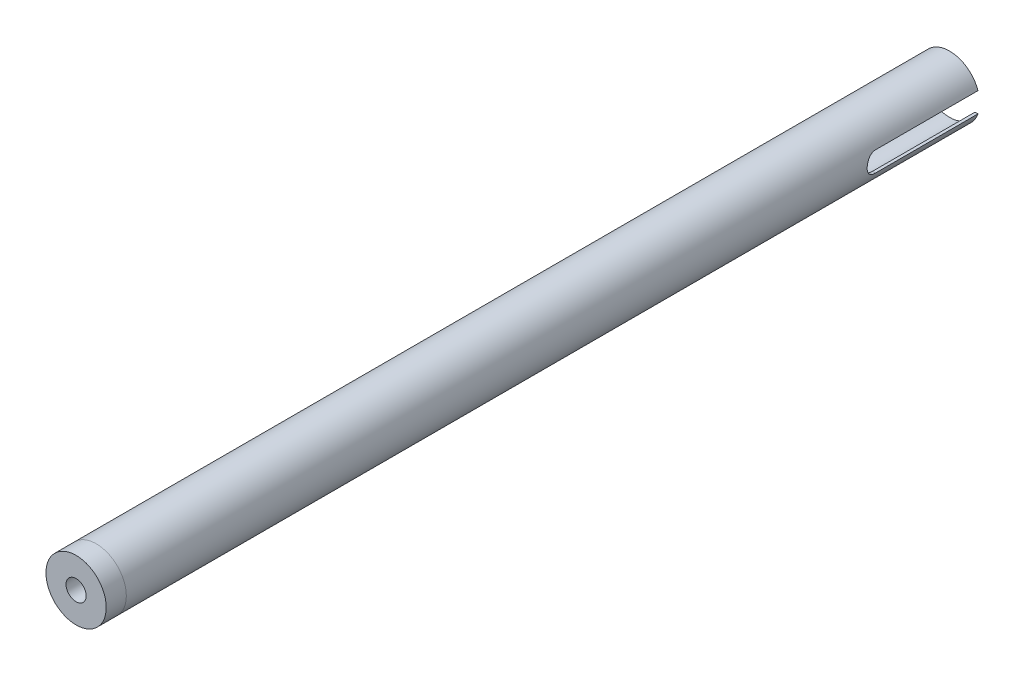
ISO-10303-21;
HEADER;
FILE_DESCRIPTION(('STEP AP214'),'2;1');
FILE_NAME('part.step','',(''),(''),'','','');
FILE_SCHEMA(('AUTOMOTIVE_DESIGN { 1 0 10303 214 1 1 1 1 }'));
ENDSEC;
DATA;
#1=APPLICATION_CONTEXT('core data for automotive mechanical design processes');
#2=APPLICATION_PROTOCOL_DEFINITION('international standard','automotive_design',2000,#1);
#3=PRODUCT_CONTEXT('',#1,'mechanical');
#4=PRODUCT('Part','Part','',(#3));
#5=PRODUCT_RELATED_PRODUCT_CATEGORY('part','',(#4));
#6=PRODUCT_DEFINITION_FORMATION('','',#4);
#7=PRODUCT_DEFINITION_CONTEXT('part definition',#1,'design');
#8=PRODUCT_DEFINITION('design','',#6,#7);
#9=PRODUCT_DEFINITION_SHAPE('','',#8);
#10=(LENGTH_UNIT() NAMED_UNIT(*) SI_UNIT(.MILLI.,.METRE.));
#11=(NAMED_UNIT(*) PLANE_ANGLE_UNIT() SI_UNIT($,.RADIAN.));
#12=(NAMED_UNIT(*) SI_UNIT($,.STERADIAN.) SOLID_ANGLE_UNIT());
#13=UNCERTAINTY_MEASURE_WITH_UNIT(LENGTH_MEASURE(1.E-05),#10,'distance_accuracy_value','');
#14=(GEOMETRIC_REPRESENTATION_CONTEXT(3) GLOBAL_UNCERTAINTY_ASSIGNED_CONTEXT((#13)) GLOBAL_UNIT_ASSIGNED_CONTEXT((#10,
#11,#12)) REPRESENTATION_CONTEXT('',''));
#15=CARTESIAN_POINT('',(0.,0.,0.));
#16=DIRECTION('',(0.,0.,1.));
#17=DIRECTION('',(1.,0.,0.));
#18=AXIS2_PLACEMENT_3D('',#15,#16,#17);
#19=CARTESIAN_POINT('',(0.,0.,-275.981356586574));
#20=DIRECTION('',(0.,0.,1.));
#21=DIRECTION('',(1.,0.,0.));
#22=AXIS2_PLACEMENT_3D('',#19,#20,#21);
#23=CYLINDRICAL_SURFACE('',#22,9.525);
#24=CARTESIAN_POINT('',(0.,0.,-6.35));
#25=DIRECTION('',(0.,0.,1.));
#26=DIRECTION('',(1.,0.,0.));
#27=AXIS2_PLACEMENT_3D('',#24,#25,#26);
#28=CIRCLE('',#27,9.525);
#29=CARTESIAN_POINT('',(9.525,0.,-6.35));
#30=VERTEX_POINT('',#29);
#31=EDGE_CURVE('E165',#30,#30,#28,.T.);
#32=ORIENTED_EDGE('',*,*,#31,.F.);
#33=EDGE_LOOP('',(#32));
#34=FACE_BOUND('',#33,.T.);
#35=CARTESIAN_POINT('',(-8.98025612106915,3.175,-243.596356586574));
#36=CARTESIAN_POINT('',(-8.98024230233901,3.17501142134308,-243.509730483238));
#37=CARTESIAN_POINT('',(-8.98150922759707,3.17145501317748,-243.423112100762));
#38=CARTESIAN_POINT('',(-8.98650170400112,3.1572955094353,-243.250547285936));
#39=CARTESIAN_POINT('',(-8.99022659113085,3.14669431699564,-243.164600678451));
#40=CARTESIAN_POINT('',(-9.00001740508998,3.11857670914846,-242.994246437286));
#41=CARTESIAN_POINT('',(-9.00607621805002,3.10108130380329,-242.909834935478));
#42=CARTESIAN_POINT('',(-9.02033586435303,3.05935434973545,-242.742900134143));
#43=CARTESIAN_POINT('',(-9.02853677497232,3.03512255799513,-242.660376902851));
#44=CARTESIAN_POINT('',(-9.05598792154067,2.95264369348964,-242.416578279575));
#45=CARTESIAN_POINT('',(-9.07810200713862,2.88457148458964,-242.258824695251));
#46=CARTESIAN_POINT('',(-9.127451360236,2.72437908867647,-241.956948176762));
#47=CARTESIAN_POINT('',(-9.15468995097455,2.63224328129309,-241.812834179533));
#48=CARTESIAN_POINT('',(-9.21240416673121,2.42269155952414,-241.536681319709));
#49=CARTESIAN_POINT('',(-9.24296008478943,2.30449853156512,-241.405247737847));
#50=CARTESIAN_POINT('',(-9.30318902123143,2.04784031127145,-241.16365244151));
#51=CARTESIAN_POINT('',(-9.33286185998227,1.90937102786996,-241.053495030278));
#52=CARTESIAN_POINT('',(-9.38892492365178,1.61159672697579,-240.85477801879));
#53=CARTESIAN_POINT('',(-9.41520772598947,1.45183792838569,-240.76686583278));
#54=CARTESIAN_POINT('',(-9.46054712430069,1.11883883316161,-240.61946110671));
#55=CARTESIAN_POINT('',(-9.47961052807859,0.945611424033749,-240.559941778708));
#56=CARTESIAN_POINT('',(-9.50410661247238,0.642992499572345,-240.484463014213));
#57=CARTESIAN_POINT('',(-9.51189798251809,0.515662964135989,-240.460845042169));
#58=CARTESIAN_POINT('',(-9.51973491912187,0.323120458247677,-240.437178775996));
#59=CARTESIAN_POINT('',(-9.52170555244691,0.258670486244967,-240.431250128379));
#60=CARTESIAN_POINT('',(-9.52433958502699,0.129484930346638,-240.423337503713));
#61=CARTESIAN_POINT('',(-9.5250026318504,0.0647492741617516,-240.421354590148));
#62=CARTESIAN_POINT('',(-9.525,0.,-240.421356586574));
#63=B_SPLINE_CURVE_WITH_KNOTS('',3,(#35,#36,#37,#38,#39,#40,#41,#42,#43,#44,#45,#46,#47,#48,#49,
#50,#51,#52,#53,#54,#55,#56,#57,#58,#59,#60,#61,#62),.UNSPECIFIED.,.F.,.F.,(4,2,2,2,2,2,2,2,2,2,
2,2,2,4),(0.,0.259783027985073,0.519495904525415,0.778423354079382,1.0373601457496,
1.55448370709136,2.07194378605916,2.60765740005747,3.14347925237351,3.69345572792677,
4.24291228331232,4.63105001394517,4.8251849841295,5.01937227204627),.UNSPECIFIED.);
#64=CARTESIAN_POINT('',(-8.98025612106915,3.175,-243.596356586574));
#65=VERTEX_POINT('',#64);
#66=CARTESIAN_POINT('',(-9.525,0.,-240.421356586574));
#67=VERTEX_POINT('',#66);
#68=EDGE_CURVE('E192',#65,#67,#63,.T.);
#69=ORIENTED_EDGE('',*,*,#68,.T.);
#70=CARTESIAN_POINT('',(-9.525,0.,-240.421356586574));
#71=CARTESIAN_POINT('',(-9.52501110102584,-0.0867614879611002,-240.421345481537));
#72=CARTESIAN_POINT('',(-9.52381482114642,-0.173516026970682,-240.424912693194));
#73=CARTESIAN_POINT('',(-9.51909010104991,-0.346361025979099,-240.439117531776));
#74=CARTESIAN_POINT('',(-9.51556219632442,-0.432451633867615,-240.449753535253));
#75=CARTESIAN_POINT('',(-9.50626969526085,-0.603121388983422,-240.477970526766));
#76=CARTESIAN_POINT('',(-9.50051134567603,-0.687704073408633,-240.495532120935));
#77=CARTESIAN_POINT('',(-9.48692170416637,-0.854983898510568,-240.537423441573));
#78=CARTESIAN_POINT('',(-9.47909035815865,-0.937680989932476,-240.561753344623));
#79=CARTESIAN_POINT('',(-9.45278540829331,-1.18202731628103,-240.644587737561));
#80=CARTESIAN_POINT('',(-9.43148823554423,-1.34014986693319,-240.712973418907));
#81=CARTESIAN_POINT('',(-9.38354405256208,-1.64264414222567,-240.873899944683));
#82=CARTESIAN_POINT('',(-9.35689419571071,-1.78700848960572,-240.966453649836));
#83=CARTESIAN_POINT('',(-9.30002401422067,-2.06291632995429,-241.176447078041));
#84=CARTESIAN_POINT('',(-9.26971861159363,-2.19392359690275,-241.294569363461));
#85=CARTESIAN_POINT('',(-9.20941732427212,-2.43468689521898,-241.550907340296));
#86=CARTESIAN_POINT('',(-9.1794215361322,-2.54443647619592,-241.689129108454));
#87=CARTESIAN_POINT('',(-9.122187697517,-2.74268087840455,-241.986637087501));
#88=CARTESIAN_POINT('',(-9.09505529775998,-2.83046425019683,-242.146419225575));
#89=CARTESIAN_POINT('',(-9.04794936227173,-2.97762337182932,-242.47946354758));
#90=CARTESIAN_POINT('',(-9.0279682579705,-3.03702917747986,-242.652711242388));
#91=CARTESIAN_POINT('',(-9.00226999890487,-3.11221256504251,-242.954998276382));
#92=CARTESIAN_POINT('',(-8.99408207355733,-3.13569679171672,-243.08196059781));
#93=CARTESIAN_POINT('',(-8.98304472933549,-3.16711304593222,-243.338037769579));
#94=CARTESIAN_POINT('',(-8.98019613476149,-3.17504267212105,-243.467152949181));
#95=CARTESIAN_POINT('',(-8.98025612106915,-3.175,-243.596356586574));
#96=B_SPLINE_CURVE_WITH_KNOTS('',3,(#70,#71,#72,#73,#74,#75,#76,#77,#78,#79,#80,#81,#82,#83,#84,
#85,#86,#87,#88,#89,#90,#91,#92,#93,#94,#95),.UNSPECIFIED.,.F.,.F.,(4,2,2,2,2,2,2,2,2,2,2,2,4),
(0.,0.260191091827301,0.520322447737218,0.779730467212509,1.03914525511039,1.55731822615721,
2.07576750062864,2.61028978360819,3.14497400776477,3.69521752133767,4.24487695078963,
4.63199348452993,5.01916977744545),.UNSPECIFIED.);
#97=CARTESIAN_POINT('',(-8.98025612106916,-3.175,-243.596356586574));
#98=VERTEX_POINT('',#97);
#99=EDGE_CURVE('E144',#67,#98,#96,.T.);
#100=ORIENTED_EDGE('',*,*,#99,.T.);
#101=DIRECTION('',(0.,0.,-1.));
#102=VECTOR('',#101,1.);
#103=CARTESIAN_POINT('',(-8.98025612106916,-3.175,-240.421356586574));
#104=LINE('',#103,#102);
#105=CARTESIAN_POINT('',(-8.98025612106916,-3.175,-275.981356586574));
#106=VERTEX_POINT('',#105);
#107=EDGE_CURVE('E139',#98,#106,#104,.T.);
#108=ORIENTED_EDGE('',*,*,#107,.T.);
#109=CARTESIAN_POINT('',(0.,0.,-275.981356586574));
#110=DIRECTION('',(0.,0.,1.));
#111=DIRECTION('',(1.,0.,0.));
#112=AXIS2_PLACEMENT_3D('',#109,#110,#111);
#113=CIRCLE('',#112,9.525);
#114=CARTESIAN_POINT('',(8.98025612106915,-3.175,-275.981356586574));
#115=VERTEX_POINT('',#114);
#116=EDGE_CURVE('E142',#106,#115,#113,.T.);
#117=ORIENTED_EDGE('',*,*,#116,.T.);
#118=DIRECTION('',(0.,0.,-1.));
#119=VECTOR('',#118,1.);
#120=CARTESIAN_POINT('',(8.98025612106915,-3.175,-240.421356586574));
#121=LINE('',#120,#119);
#122=CARTESIAN_POINT('',(8.98025612106915,-3.175,-243.596356586574));
#123=VERTEX_POINT('',#122);
#124=EDGE_CURVE('E425',#123,#115,#121,.T.);
#125=ORIENTED_EDGE('',*,*,#124,.F.);
#126=CARTESIAN_POINT('',(8.98025612106915,-3.175,-243.596356586574));
#127=CARTESIAN_POINT('',(8.98024230233901,-3.17501142134308,-243.509730483238));
#128=CARTESIAN_POINT('',(8.98150922759707,-3.17145501317748,-243.423112100762));
#129=CARTESIAN_POINT('',(8.98650170400112,-3.1572955094353,-243.250547285936));
#130=CARTESIAN_POINT('',(8.99022659113085,-3.14669431699564,-243.164600678451));
#131=CARTESIAN_POINT('',(9.00001740508998,-3.11857670914846,-242.994246437286));
#132=CARTESIAN_POINT('',(9.00607621805002,-3.10108130380329,-242.909834935478));
#133=CARTESIAN_POINT('',(9.02033586435303,-3.05935434973545,-242.742900134143));
#134=CARTESIAN_POINT('',(9.02853677497232,-3.03512255799513,-242.660376902851));
#135=CARTESIAN_POINT('',(9.05598792154067,-2.95264369348964,-242.416578279575));
#136=CARTESIAN_POINT('',(9.07810200713862,-2.88457148458964,-242.258824695251));
#137=CARTESIAN_POINT('',(9.127451360236,-2.72437908867647,-241.956948176762));
#138=CARTESIAN_POINT('',(9.15468995097455,-2.63224328129309,-241.812834179533));
#139=CARTESIAN_POINT('',(9.21240416673121,-2.42269155952414,-241.536681319709));
#140=CARTESIAN_POINT('',(9.24296008478943,-2.30449853156512,-241.405247737847));
#141=CARTESIAN_POINT('',(9.30318902123143,-2.04784031127145,-241.16365244151));
#142=CARTESIAN_POINT('',(9.33286185998227,-1.90937102786996,-241.053495030278));
#143=CARTESIAN_POINT('',(9.38892492365178,-1.61159672697579,-240.85477801879));
#144=CARTESIAN_POINT('',(9.41520772598947,-1.45183792838569,-240.76686583278));
#145=CARTESIAN_POINT('',(9.46054712430069,-1.11883883316161,-240.61946110671));
#146=CARTESIAN_POINT('',(9.47961052807859,-0.945611424033749,-240.559941778708));
#147=CARTESIAN_POINT('',(9.50410661247238,-0.642992499572345,-240.484463014213));
#148=CARTESIAN_POINT('',(9.51189798251809,-0.515662964135989,-240.460845042169));
#149=CARTESIAN_POINT('',(9.51973491912187,-0.323120458247677,-240.437178775996));
#150=CARTESIAN_POINT('',(9.52170555244691,-0.258670486244967,-240.431250128379));
#151=CARTESIAN_POINT('',(9.52433958502699,-0.129484930346638,-240.423337503713));
#152=CARTESIAN_POINT('',(9.5250026318504,-0.0647492741617516,-240.421354590148));
#153=CARTESIAN_POINT('',(9.525,0.,-240.421356586574));
#154=B_SPLINE_CURVE_WITH_KNOTS('',3,(#126,#127,#128,#129,#130,#131,#132,#133,#134,#135,#136,
#137,#138,#139,#140,#141,#142,#143,#144,#145,#146,#147,#148,#149,#150,#151,#152,#153),
.UNSPECIFIED.,.F.,.F.,(4,2,2,2,2,2,2,2,2,2,2,2,2,4),(0.,0.259783027985073,0.519495904525415,
0.778423354079382,1.0373601457496,1.55448370709136,2.07194378605916,2.60765740005747,
3.14347925237351,3.69345572792677,4.24291228331232,4.63105001394517,4.8251849841295,
5.01937227204627),.UNSPECIFIED.);
#155=CARTESIAN_POINT('',(9.525,0.,-240.421356586574));
#156=VERTEX_POINT('',#155);
#157=EDGE_CURVE('E85',#123,#156,#154,.T.);
#158=ORIENTED_EDGE('',*,*,#157,.T.);
#159=CARTESIAN_POINT('',(9.525,0.,-240.421356586574));
#160=CARTESIAN_POINT('',(9.52501110102584,0.0867614879611002,-240.421345481537));
#161=CARTESIAN_POINT('',(9.52381482114642,0.173516026970682,-240.424912693194));
#162=CARTESIAN_POINT('',(9.51909010104991,0.346361025979099,-240.439117531776));
#163=CARTESIAN_POINT('',(9.51556219632442,0.432451633867615,-240.449753535253));
#164=CARTESIAN_POINT('',(9.50626969526085,0.603121388983422,-240.477970526766));
#165=CARTESIAN_POINT('',(9.50051134567603,0.687704073408633,-240.495532120935));
#166=CARTESIAN_POINT('',(9.48692170416637,0.854983898510568,-240.537423441573));
#167=CARTESIAN_POINT('',(9.47909035815865,0.937680989932476,-240.561753344623));
#168=CARTESIAN_POINT('',(9.45278540829331,1.18202731628103,-240.644587737561));
#169=CARTESIAN_POINT('',(9.43148823554423,1.34014986693319,-240.712973418907));
#170=CARTESIAN_POINT('',(9.38354405256208,1.64264414222567,-240.873899944683));
#171=CARTESIAN_POINT('',(9.35689419571071,1.78700848960572,-240.966453649836));
#172=CARTESIAN_POINT('',(9.30002401422067,2.06291632995429,-241.176447078041));
#173=CARTESIAN_POINT('',(9.26971861159363,2.19392359690275,-241.294569363461));
#174=CARTESIAN_POINT('',(9.20941732427212,2.43468689521898,-241.550907340296));
#175=CARTESIAN_POINT('',(9.1794215361322,2.54443647619592,-241.689129108454));
#176=CARTESIAN_POINT('',(9.122187697517,2.74268087840455,-241.986637087501));
#177=CARTESIAN_POINT('',(9.09505529775998,2.83046425019683,-242.146419225575));
#178=CARTESIAN_POINT('',(9.04794936227173,2.97762337182932,-242.47946354758));
#179=CARTESIAN_POINT('',(9.0279682579705,3.03702917747986,-242.652711242388));
#180=CARTESIAN_POINT('',(9.00226999890487,3.11221256504251,-242.954998276382));
#181=CARTESIAN_POINT('',(8.99408207355733,3.13569679171672,-243.08196059781));
#182=CARTESIAN_POINT('',(8.98304472933549,3.16711304593222,-243.338037769579));
#183=CARTESIAN_POINT('',(8.98019613476149,3.17504267212105,-243.467152949181));
#184=CARTESIAN_POINT('',(8.98025612106915,3.175,-243.596356586574));
#185=B_SPLINE_CURVE_WITH_KNOTS('',3,(#159,#160,#161,#162,#163,#164,#165,#166,#167,#168,#169,
#170,#171,#172,#173,#174,#175,#176,#177,#178,#179,#180,#181,#182,#183,#184),.UNSPECIFIED.,.F.,
.F.,(4,2,2,2,2,2,2,2,2,2,2,2,4),(0.,0.260191091827301,0.520322447737218,0.779730467212509,
1.03914525511039,1.55731822615721,2.07576750062864,2.61028978360819,3.14497400776477,
3.69521752133767,4.24487695078963,4.63199348452993,5.01916977744545),.UNSPECIFIED.);
#186=CARTESIAN_POINT('',(8.98025612106915,3.175,-243.596356586574));
#187=VERTEX_POINT('',#186);
#188=EDGE_CURVE('E71',#156,#187,#185,.T.);
#189=ORIENTED_EDGE('',*,*,#188,.T.);
#190=DIRECTION('',(0.,0.,-1.));
#191=VECTOR('',#190,1.);
#192=CARTESIAN_POINT('',(8.98025612106915,3.175,-240.421356586574));
#193=LINE('',#192,#191);
#194=CARTESIAN_POINT('',(8.98025612106915,3.175,-275.981356586574));
#195=VERTEX_POINT('',#194);
#196=EDGE_CURVE('E158',#187,#195,#193,.T.);
#197=ORIENTED_EDGE('',*,*,#196,.T.);
#198=CARTESIAN_POINT('',(-8.98025612106915,3.175,-275.981356586574));
#199=VERTEX_POINT('',#198);
#200=EDGE_CURVE('E164',#195,#199,#113,.T.);
#201=ORIENTED_EDGE('',*,*,#200,.T.);
#202=DIRECTION('',(0.,0.,-1.));
#203=VECTOR('',#202,1.);
#204=CARTESIAN_POINT('',(-8.98025612106915,3.175,-240.421356586574));
#205=LINE('',#204,#203);
#206=EDGE_CURVE('E418',#65,#199,#205,.T.);
#207=ORIENTED_EDGE('',*,*,#206,.F.);
#208=EDGE_LOOP('',(#69,#100,#108,#117,#125,#158,#189,#197,#201,#207));
#209=FACE_BOUND('',#208,.T.);
#210=ADVANCED_FACE('F61',(#34,#209),#23,.T.);
#211=CARTESIAN_POINT('',(0.,0.,-275.981356586574));
#212=DIRECTION('',(0.,0.,1.));
#213=DIRECTION('',(1.,0.,0.));
#214=AXIS2_PLACEMENT_3D('',#211,#212,#213);
#215=PLANE('',#214);
#216=DIRECTION('',(1.,0.,0.));
#217=VECTOR('',#216,1.);
#218=CARTESIAN_POINT('',(0.,-3.175,-275.981356586574));
#219=LINE('',#218,#217);
#220=CARTESIAN_POINT('',(-8.03118117091129,-3.175,-275.981356586574));
#221=VERTEX_POINT('',#220);
#222=EDGE_CURVE('E151',#106,#221,#219,.T.);
#223=ORIENTED_EDGE('',*,*,#222,.T.);
#224=CARTESIAN_POINT('',(0.,0.,-275.981356586574));
#225=DIRECTION('',(0.,0.,1.));
#226=DIRECTION('',(1.,0.,0.));
#227=AXIS2_PLACEMENT_3D('',#224,#225,#226);
#228=CIRCLE('',#227,8.636);
#229=CARTESIAN_POINT('',(8.03118117091129,-3.175,-275.981356586574));
#230=VERTEX_POINT('',#229);
#231=EDGE_CURVE('E273',#221,#230,#228,.T.);
#232=ORIENTED_EDGE('',*,*,#231,.T.);
#233=DIRECTION('',(1.,0.,0.));
#234=VECTOR('',#233,1.);
#235=CARTESIAN_POINT('',(0.,-3.175,-275.981356586574));
#236=LINE('',#235,#234);
#237=EDGE_CURVE('E163',#230,#115,#236,.T.);
#238=ORIENTED_EDGE('',*,*,#237,.T.);
#239=ORIENTED_EDGE('',*,*,#116,.F.);
#240=EDGE_LOOP('',(#223,#232,#238,#239));
#241=FACE_BOUND('',#240,.T.);
#242=ADVANCED_FACE('F161',(#241),#215,.F.);
#243=CARTESIAN_POINT('',(0.,0.,-275.981356586574));
#244=DIRECTION('',(0.,0.,1.));
#245=DIRECTION('',(1.,0.,0.));
#246=AXIS2_PLACEMENT_3D('',#243,#244,#245);
#247=CYLINDRICAL_SURFACE('',#246,8.636);
#248=CARTESIAN_POINT('',(0.,0.,-6.35));
#249=DIRECTION('',(0.,0.,1.));
#250=DIRECTION('',(1.,0.,0.));
#251=AXIS2_PLACEMENT_3D('',#248,#249,#250);
#252=CIRCLE('',#251,8.636);
#253=CARTESIAN_POINT('',(8.636,0.,-6.35));
#254=VERTEX_POINT('',#253);
#255=EDGE_CURVE('E147',#254,#254,#252,.T.);
#256=ORIENTED_EDGE('',*,*,#255,.T.);
#257=EDGE_LOOP('',(#256));
#258=FACE_BOUND('',#257,.T.);
#259=DIRECTION('',(0.,0.,-1.));
#260=VECTOR('',#259,1.);
#261=CARTESIAN_POINT('',(-8.03118117091129,-3.175,-240.421356586574));
#262=LINE('',#261,#260);
#263=CARTESIAN_POINT('',(-8.03118117091129,-3.175,-243.596356586574));
#264=VERTEX_POINT('',#263);
#265=EDGE_CURVE('E148',#264,#221,#262,.T.);
#266=ORIENTED_EDGE('',*,*,#265,.F.);
#267=CARTESIAN_POINT('',(-8.03118117091129,-3.175,-243.596356586574));
#268=CARTESIAN_POINT('',(-8.03116550357192,-3.17501203663229,-243.510321618458));
#269=CARTESIAN_POINT('',(-8.03256328665432,-3.17150327993898,-243.424295265929));
#270=CARTESIAN_POINT('',(-8.03806891362409,-3.15753809299539,-243.25292269546));
#271=CARTESIAN_POINT('',(-8.04217588089715,-3.147083910078,-243.167576266554));
#272=CARTESIAN_POINT('',(-8.05296421917626,-3.11937037021479,-242.998467132338));
#273=CARTESIAN_POINT('',(-8.05963650808002,-3.10213501593151,-242.914699921396));
#274=CARTESIAN_POINT('',(-8.07533202922415,-3.06104389654163,-242.749050958628));
#275=CARTESIAN_POINT('',(-8.08435537430867,-3.03718781365489,-242.667169297509));
#276=CARTESIAN_POINT('',(-8.11453837074661,-2.95603278100126,-242.425317140264));
#277=CARTESIAN_POINT('',(-8.13883087950845,-2.88909903597751,-242.268850502688));
#278=CARTESIAN_POINT('',(-8.19300406693487,-2.7316794881875,-241.969315513563));
#279=CARTESIAN_POINT('',(-8.2228893144862,-2.64117440539559,-241.826258261007));
#280=CARTESIAN_POINT('',(-8.28646461334555,-2.43457537576573,-241.550787851769));
#281=CARTESIAN_POINT('',(-8.32026315150129,-2.31754645569598,-241.419099479682));
#282=CARTESIAN_POINT('',(-8.38695072719909,-2.06320558041452,-241.176711301288));
#283=CARTESIAN_POINT('',(-8.41983956911545,-1.92588930215217,-241.066015979918));
#284=CARTESIAN_POINT('',(-8.48230406273647,-1.62932475427475,-240.865234864968));
#285=CARTESIAN_POINT('',(-8.51173519592471,-1.46950375402868,-240.775946511462));
#286=CARTESIAN_POINT('',(-8.56262575627031,-1.13591027783605,-240.625884358498));
#287=CARTESIAN_POINT('',(-8.58409342507971,-0.962152453429188,-240.565081061679));
#288=CARTESIAN_POINT('',(-8.61197450421745,-0.656412542712551,-240.487156696029));
#289=CARTESIAN_POINT('',(-8.62092967235125,-0.52653821034923,-240.46254091169));
#290=CARTESIAN_POINT('',(-8.62994176115801,-0.33002097693849,-240.437863579975));
#291=CARTESIAN_POINT('',(-8.63220903333297,-0.264206342476339,-240.431678840824));
#292=CARTESIAN_POINT('',(-8.63523992352765,-0.132266265743968,-240.423423625379));
#293=CARTESIAN_POINT('',(-8.6360031097792,-0.0661407396870625,-240.421354330476));
#294=CARTESIAN_POINT('',(-8.636,0.,-240.421356586574));
#295=B_SPLINE_CURVE_WITH_KNOTS('',3,(#267,#268,#269,#270,#271,#272,#273,#274,#275,#276,#277,
#278,#279,#280,#281,#282,#283,#284,#285,#286,#287,#288,#289,#290,#291,#292,#293,#294),
.UNSPECIFIED.,.F.,.F.,(4,2,2,2,2,2,2,2,2,2,2,2,2,4),(0.,0.258007583993629,0.515931725057033,
0.772951013405637,1.02998264023841,1.54317615093285,2.05679075055087,2.59254838663383,
3.12842035287703,3.68191422398172,4.23483365719867,4.63113823379686,4.8294369210689,
5.02779252437178),.UNSPECIFIED.);
#296=CARTESIAN_POINT('',(-8.636,0.,-240.421356586574));
#297=VERTEX_POINT('',#296);
#298=EDGE_CURVE('E219',#264,#297,#295,.T.);
#299=ORIENTED_EDGE('',*,*,#298,.T.);
#300=CARTESIAN_POINT('',(-8.636,0.,-240.421356586574));
#301=CARTESIAN_POINT('',(-8.63601200177566,0.0862340545028649,-240.42134501285));
#302=CARTESIAN_POINT('',(-8.63470866649585,0.172460638964014,-240.424869552871));
#303=CARTESIAN_POINT('',(-8.62956076290727,0.34424536862396,-240.438900982501));
#304=CARTESIAN_POINT('',(-8.62571686385256,0.429803683858972,-240.449406033257));
#305=CARTESIAN_POINT('',(-8.61559314175803,0.599377201936824,-240.477264787312));
#306=CARTESIAN_POINT('',(-8.60932102288695,0.683396413719316,-240.494596833168));
#307=CARTESIAN_POINT('',(-8.5945171663722,0.84955353944947,-240.535928056444));
#308=CARTESIAN_POINT('',(-8.58598535382315,0.931691390934835,-240.559927454877));
#309=CARTESIAN_POINT('',(-8.55732464851214,1.17435074221828,-240.641601636314));
#310=CARTESIAN_POINT('',(-8.53411500636261,1.33136171263577,-240.708992957281));
#311=CARTESIAN_POINT('',(-8.48180653117632,1.63181198358794,-240.86748466729));
#312=CARTESIAN_POINT('',(-8.45270389942466,1.77524244193608,-240.958600360327));
#313=CARTESIAN_POINT('',(-8.39029834803106,2.05036661398533,-241.165853478006));
#314=CARTESIAN_POINT('',(-8.35688032192871,2.18143474113563,-241.282787845598));
#315=CARTESIAN_POINT('',(-8.29018507770489,2.42260670191498,-241.536676832055));
#316=CARTESIAN_POINT('',(-8.25690791509208,2.53270290926751,-241.673638701885));
#317=CARTESIAN_POINT('',(-8.19291826363247,2.73277128594142,-241.96980379071));
#318=CARTESIAN_POINT('',(-8.16234475412033,2.82185641770733,-242.129638880147));
#319=CARTESIAN_POINT('',(-8.10906121054024,2.97153048258985,-242.463234223649));
#320=CARTESIAN_POINT('',(-8.08634169503735,3.03215380703845,-242.636977373318));
#321=CARTESIAN_POINT('',(-8.05677760160867,3.10966172606007,-242.94224600813));
#322=CARTESIAN_POINT('',(-8.04725077861386,3.13409804308656,-243.071626727336));
#323=CARTESIAN_POINT('',(-8.03764862425496,3.15860280233702,-243.267433853177));
#324=CARTESIAN_POINT('',(-8.0352292163598,3.16474613160122,-243.333026609483));
#325=CARTESIAN_POINT('',(-8.03199317651195,3.17294655384153,-243.464526561872));
#326=CARTESIAN_POINT('',(-8.03117703985816,3.17500238406813,-243.530433848823));
#327=CARTESIAN_POINT('',(-8.03118117091129,3.175,-243.596356586574));
#328=B_SPLINE_CURVE_WITH_KNOTS('',3,(#300,#301,#302,#303,#304,#305,#306,#307,#308,#309,#310,
#311,#312,#313,#314,#315,#316,#317,#318,#319,#320,#321,#322,#323,#324,#325,#326,#327),
.UNSPECIFIED.,.F.,.F.,(4,2,2,2,2,2,2,2,2,2,2,2,2,4),(0.,0.258607684277236,0.517147271349145,
0.774873208333403,1.0326076896076,1.54734347080468,2.06241212125686,2.59642224394464,
3.13062618611959,3.68443916069367,4.237581211598,4.63245186558866,4.83009172977029,
5.02779264127874),.UNSPECIFIED.);
#329=CARTESIAN_POINT('',(-8.03118117091129,3.175,-243.596356586574));
#330=VERTEX_POINT('',#329);
#331=EDGE_CURVE('E184',#297,#330,#328,.T.);
#332=ORIENTED_EDGE('',*,*,#331,.T.);
#333=DIRECTION('',(0.,0.,-1.));
#334=VECTOR('',#333,1.);
#335=CARTESIAN_POINT('',(-8.03118117091129,3.175,-240.421356586574));
#336=LINE('',#335,#334);
#337=CARTESIAN_POINT('',(-8.03118117091129,3.175,-275.981356586574));
#338=VERTEX_POINT('',#337);
#339=EDGE_CURVE('E415',#330,#338,#336,.T.);
#340=ORIENTED_EDGE('',*,*,#339,.T.);
#341=CARTESIAN_POINT('',(8.03118117091129,3.175,-275.981356586574));
#342=VERTEX_POINT('',#341);
#343=EDGE_CURVE('E170',#342,#338,#228,.T.);
#344=ORIENTED_EDGE('',*,*,#343,.F.);
#345=DIRECTION('',(0.,0.,-1.));
#346=VECTOR('',#345,1.);
#347=CARTESIAN_POINT('',(8.03118117091129,3.175,-240.421356586574));
#348=LINE('',#347,#346);
#349=CARTESIAN_POINT('',(8.03118117091129,3.175,-243.596356586574));
#350=VERTEX_POINT('',#349);
#351=EDGE_CURVE('E267',#350,#342,#348,.T.);
#352=ORIENTED_EDGE('',*,*,#351,.F.);
#353=CARTESIAN_POINT('',(8.03118117091129,3.175,-243.596356586574));
#354=CARTESIAN_POINT('',(8.03116550357192,3.17501203663229,-243.510321618458));
#355=CARTESIAN_POINT('',(8.03256328665432,3.17150327993898,-243.424295265929));
#356=CARTESIAN_POINT('',(8.03806891362409,3.15753809299539,-243.25292269546));
#357=CARTESIAN_POINT('',(8.04217588089715,3.147083910078,-243.167576266554));
#358=CARTESIAN_POINT('',(8.05296421917626,3.11937037021479,-242.998467132338));
#359=CARTESIAN_POINT('',(8.05963650808002,3.10213501593151,-242.914699921396));
#360=CARTESIAN_POINT('',(8.07533202922415,3.06104389654163,-242.749050958628));
#361=CARTESIAN_POINT('',(8.08435537430867,3.03718781365489,-242.667169297509));
#362=CARTESIAN_POINT('',(8.11453837074661,2.95603278100126,-242.425317140264));
#363=CARTESIAN_POINT('',(8.13883087950845,2.88909903597751,-242.268850502688));
#364=CARTESIAN_POINT('',(8.19300406693487,2.7316794881875,-241.969315513563));
#365=CARTESIAN_POINT('',(8.2228893144862,2.64117440539559,-241.826258261007));
#366=CARTESIAN_POINT('',(8.28646461334555,2.43457537576573,-241.550787851769));
#367=CARTESIAN_POINT('',(8.32026315150129,2.31754645569598,-241.419099479682));
#368=CARTESIAN_POINT('',(8.38695072719909,2.06320558041452,-241.176711301288));
#369=CARTESIAN_POINT('',(8.41983956911545,1.92588930215217,-241.066015979918));
#370=CARTESIAN_POINT('',(8.48230406273647,1.62932475427475,-240.865234864968));
#371=CARTESIAN_POINT('',(8.51173519592471,1.46950375402868,-240.775946511462));
#372=CARTESIAN_POINT('',(8.56262575627031,1.13591027783605,-240.625884358498));
#373=CARTESIAN_POINT('',(8.58409342507971,0.962152453429188,-240.565081061679));
#374=CARTESIAN_POINT('',(8.61197450421745,0.656412542712551,-240.487156696029));
#375=CARTESIAN_POINT('',(8.62092967235125,0.52653821034923,-240.46254091169));
#376=CARTESIAN_POINT('',(8.62994176115801,0.33002097693849,-240.437863579975));
#377=CARTESIAN_POINT('',(8.63220903333297,0.264206342476339,-240.431678840824));
#378=CARTESIAN_POINT('',(8.63523992352765,0.132266265743968,-240.423423625379));
#379=CARTESIAN_POINT('',(8.6360031097792,0.0661407396870625,-240.421354330476));
#380=CARTESIAN_POINT('',(8.636,0.,-240.421356586574));
#381=B_SPLINE_CURVE_WITH_KNOTS('',3,(#353,#354,#355,#356,#357,#358,#359,#360,#361,#362,#363,
#364,#365,#366,#367,#368,#369,#370,#371,#372,#373,#374,#375,#376,#377,#378,#379,#380),
.UNSPECIFIED.,.F.,.F.,(4,2,2,2,2,2,2,2,2,2,2,2,2,4),(0.,0.258007583993629,0.515931725057033,
0.772951013405637,1.02998264023841,1.54317615093285,2.05679075055087,2.59254838663383,
3.12842035287703,3.68191422398172,4.23483365719867,4.63113823379686,4.8294369210689,
5.02779252437178),.UNSPECIFIED.);
#382=CARTESIAN_POINT('',(8.636,0.,-240.421356586574));
#383=VERTEX_POINT('',#382);
#384=EDGE_CURVE('E13',#350,#383,#381,.T.);
#385=ORIENTED_EDGE('',*,*,#384,.T.);
#386=CARTESIAN_POINT('',(8.636,0.,-240.421356586574));
#387=CARTESIAN_POINT('',(8.63601200177566,-0.0862340545028649,-240.42134501285));
#388=CARTESIAN_POINT('',(8.63470866649585,-0.172460638964014,-240.424869552871));
#389=CARTESIAN_POINT('',(8.62956076290727,-0.34424536862396,-240.438900982501));
#390=CARTESIAN_POINT('',(8.62571686385256,-0.429803683858972,-240.449406033257));
#391=CARTESIAN_POINT('',(8.61559314175803,-0.599377201936824,-240.477264787312));
#392=CARTESIAN_POINT('',(8.60932102288695,-0.683396413719316,-240.494596833168));
#393=CARTESIAN_POINT('',(8.5945171663722,-0.84955353944947,-240.535928056444));
#394=CARTESIAN_POINT('',(8.58598535382315,-0.931691390934835,-240.559927454877));
#395=CARTESIAN_POINT('',(8.55732464851214,-1.17435074221828,-240.641601636314));
#396=CARTESIAN_POINT('',(8.53411500636261,-1.33136171263577,-240.708992957281));
#397=CARTESIAN_POINT('',(8.48180653117632,-1.63181198358794,-240.86748466729));
#398=CARTESIAN_POINT('',(8.45270389942466,-1.77524244193608,-240.958600360327));
#399=CARTESIAN_POINT('',(8.39029834803106,-2.05036661398533,-241.165853478006));
#400=CARTESIAN_POINT('',(8.35688032192871,-2.18143474113563,-241.282787845598));
#401=CARTESIAN_POINT('',(8.29018507770489,-2.42260670191498,-241.536676832055));
#402=CARTESIAN_POINT('',(8.25690791509208,-2.53270290926751,-241.673638701885));
#403=CARTESIAN_POINT('',(8.19291826363247,-2.73277128594142,-241.96980379071));
#404=CARTESIAN_POINT('',(8.16234475412033,-2.82185641770733,-242.129638880147));
#405=CARTESIAN_POINT('',(8.10906121054024,-2.97153048258985,-242.463234223649));
#406=CARTESIAN_POINT('',(8.08634169503735,-3.03215380703845,-242.636977373318));
#407=CARTESIAN_POINT('',(8.05677760160867,-3.10966172606007,-242.94224600813));
#408=CARTESIAN_POINT('',(8.04725077861386,-3.13409804308656,-243.071626727336));
#409=CARTESIAN_POINT('',(8.03764862425496,-3.15860280233702,-243.267433853177));
#410=CARTESIAN_POINT('',(8.0352292163598,-3.16474613160122,-243.333026609483));
#411=CARTESIAN_POINT('',(8.03199317651195,-3.17294655384153,-243.464526561872));
#412=CARTESIAN_POINT('',(8.03117703985816,-3.17500238406813,-243.530433848823));
#413=CARTESIAN_POINT('',(8.03118117091129,-3.175,-243.596356586574));
#414=B_SPLINE_CURVE_WITH_KNOTS('',3,(#386,#387,#388,#389,#390,#391,#392,#393,#394,#395,#396,
#397,#398,#399,#400,#401,#402,#403,#404,#405,#406,#407,#408,#409,#410,#411,#412,#413),
.UNSPECIFIED.,.F.,.F.,(4,2,2,2,2,2,2,2,2,2,2,2,2,4),(0.,0.258607684277236,0.517147271349145,
0.774873208333403,1.0326076896076,1.54734347080468,2.06241212125686,2.59642224394464,
3.13062618611959,3.68443916069367,4.237581211598,4.63245186558866,4.83009172977029,
5.02779264127874),.UNSPECIFIED.);
#415=CARTESIAN_POINT('',(8.03118117091129,-3.175,-243.596356586574));
#416=VERTEX_POINT('',#415);
#417=EDGE_CURVE('E235',#383,#416,#414,.T.);
#418=ORIENTED_EDGE('',*,*,#417,.T.);
#419=DIRECTION('',(0.,0.,-1.));
#420=VECTOR('',#419,1.);
#421=CARTESIAN_POINT('',(8.03118117091129,-3.175,-240.421356586574));
#422=LINE('',#421,#420);
#423=EDGE_CURVE('E269',#416,#230,#422,.T.);
#424=ORIENTED_EDGE('',*,*,#423,.T.);
#425=ORIENTED_EDGE('',*,*,#231,.F.);
#426=EDGE_LOOP('',(#266,#299,#332,#340,#344,#352,#385,#418,#424,#425));
#427=FACE_BOUND('',#426,.T.);
#428=ADVANCED_FACE('F199',(#258,#427),#247,.F.);
#429=ORIENTED_EDGE('',*,*,#343,.T.);
#430=DIRECTION('',(1.,0.,0.));
#431=VECTOR('',#430,1.);
#432=CARTESIAN_POINT('',(0.,3.175,-275.981356586574));
#433=LINE('',#432,#431);
#434=EDGE_CURVE('E157',#199,#338,#433,.T.);
#435=ORIENTED_EDGE('',*,*,#434,.F.);
#436=ORIENTED_EDGE('',*,*,#200,.F.);
#437=DIRECTION('',(1.,0.,0.));
#438=VECTOR('',#437,1.);
#439=CARTESIAN_POINT('',(0.,3.175,-275.981356586574));
#440=LINE('',#439,#438);
#441=EDGE_CURVE('E251',#342,#195,#440,.T.);
#442=ORIENTED_EDGE('',*,*,#441,.F.);
#443=EDGE_LOOP('',(#429,#435,#436,#442));
#444=FACE_BOUND('',#443,.T.);
#445=ADVANCED_FACE('F284',(#444),#215,.F.);
#446=CARTESIAN_POINT('',(0.,0.,-6.35));
#447=DIRECTION('',(0.,0.,1.));
#448=DIRECTION('',(1.,0.,0.));
#449=AXIS2_PLACEMENT_3D('',#446,#447,#448);
#450=PLANE('',#449);
#451=ORIENTED_EDGE('',*,*,#255,.F.);
#452=EDGE_LOOP('',(#451));
#453=FACE_BOUND('',#452,.T.);
#454=ORIENTED_EDGE('',*,*,#31,.T.);
#455=EDGE_LOOP('',(#454));
#456=FACE_BOUND('',#455,.T.);
#457=ADVANCED_FACE('F281',(#453,#456),#450,.T.);
#458=CARTESIAN_POINT('',(0.,3.175,-240.421356586574));
#459=DIRECTION('',(0.,1.,0.));
#460=DIRECTION('',(0.,0.,1.));
#461=AXIS2_PLACEMENT_3D('',#458,#459,#460);
#462=PLANE('',#461);
#463=ORIENTED_EDGE('',*,*,#196,.F.);
#464=DIRECTION('',(1.,0.,0.));
#465=VECTOR('',#464,1.);
#466=CARTESIAN_POINT('',(8.03118117091129,3.175,-243.596356586574));
#467=LINE('',#466,#465);
#468=EDGE_CURVE('E182',#187,#350,#467,.F.);
#469=ORIENTED_EDGE('',*,*,#468,.T.);
#470=ORIENTED_EDGE('',*,*,#351,.T.);
#471=ORIENTED_EDGE('',*,*,#441,.T.);
#472=EDGE_LOOP('',(#463,#469,#470,#471));
#473=FACE_BOUND('',#472,.T.);
#474=ADVANCED_FACE('F264',(#473),#462,.F.);
#475=CARTESIAN_POINT('',(0.,-3.175,-240.421356586574));
#476=DIRECTION('',(0.,1.,0.));
#477=DIRECTION('',(0.,0.,1.));
#478=AXIS2_PLACEMENT_3D('',#475,#476,#477);
#479=PLANE('',#478);
#480=ORIENTED_EDGE('',*,*,#423,.F.);
#481=DIRECTION('',(1.,0.,0.));
#482=VECTOR('',#481,1.);
#483=CARTESIAN_POINT('',(0.,-3.175,-243.596356586574));
#484=LINE('',#483,#482);
#485=EDGE_CURVE('E179',#416,#123,#484,.T.);
#486=ORIENTED_EDGE('',*,*,#485,.T.);
#487=ORIENTED_EDGE('',*,*,#124,.T.);
#488=ORIENTED_EDGE('',*,*,#237,.F.);
#489=EDGE_LOOP('',(#480,#486,#487,#488));
#490=FACE_BOUND('',#489,.T.);
#491=ADVANCED_FACE('F359',(#490),#479,.T.);
#492=CARTESIAN_POINT('',(0.,-3.175,-240.421356586574));
#493=DIRECTION('',(0.,1.,0.));
#494=DIRECTION('',(0.,0.,1.));
#495=AXIS2_PLACEMENT_3D('',#492,#493,#494);
#496=PLANE('',#495);
#497=ORIENTED_EDGE('',*,*,#107,.F.);
#498=DIRECTION('',(1.,0.,0.));
#499=VECTOR('',#498,1.);
#500=CARTESIAN_POINT('',(0.,-3.175,-243.596356586574));
#501=LINE('',#500,#499);
#502=EDGE_CURVE('E177',#98,#264,#501,.T.);
#503=ORIENTED_EDGE('',*,*,#502,.T.);
#504=ORIENTED_EDGE('',*,*,#265,.T.);
#505=ORIENTED_EDGE('',*,*,#222,.F.);
#506=EDGE_LOOP('',(#497,#503,#504,#505));
#507=FACE_BOUND('',#506,.T.);
#508=ADVANCED_FACE('F152',(#507),#496,.T.);
#509=CARTESIAN_POINT('',(0.,3.175,-240.421356586574));
#510=DIRECTION('',(0.,1.,0.));
#511=DIRECTION('',(0.,0.,1.));
#512=AXIS2_PLACEMENT_3D('',#509,#510,#511);
#513=PLANE('',#512);
#514=ORIENTED_EDGE('',*,*,#339,.F.);
#515=DIRECTION('',(1.,0.,0.));
#516=VECTOR('',#515,1.);
#517=CARTESIAN_POINT('',(-8.98025612106915,3.175,-243.596356586574));
#518=LINE('',#517,#516);
#519=EDGE_CURVE('E168',#330,#65,#518,.F.);
#520=ORIENTED_EDGE('',*,*,#519,.T.);
#521=ORIENTED_EDGE('',*,*,#206,.T.);
#522=ORIENTED_EDGE('',*,*,#434,.T.);
#523=EDGE_LOOP('',(#514,#520,#521,#522));
#524=FACE_BOUND('',#523,.T.);
#525=ADVANCED_FACE('F214',(#524),#513,.F.);
#526=CARTESIAN_POINT('',(0.,0.,-243.596356586574));
#527=DIRECTION('',(1.,0.,0.));
#528=DIRECTION('',(0.,0.,-1.));
#529=AXIS2_PLACEMENT_3D('',#526,#527,#528);
#530=CYLINDRICAL_SURFACE('',#529,3.175);
#531=ORIENTED_EDGE('',*,*,#502,.F.);
#532=ORIENTED_EDGE('',*,*,#99,.F.);
#533=DIRECTION('',(1.,0.,0.));
#534=VECTOR('',#533,1.);
#535=CARTESIAN_POINT('',(0.,0.,-240.421356586574));
#536=LINE('',#535,#534);
#537=EDGE_CURVE('E249',#297,#67,#536,.F.);
#538=ORIENTED_EDGE('',*,*,#537,.F.);
#539=ORIENTED_EDGE('',*,*,#298,.F.);
#540=EDGE_LOOP('',(#531,#532,#538,#539));
#541=FACE_BOUND('',#540,.T.);
#542=ADVANCED_FACE('F207',(#541),#530,.F.);
#543=CARTESIAN_POINT('',(0.,0.,-243.596356586574));
#544=DIRECTION('',(-1.,0.,0.));
#545=DIRECTION('',(0.,0.,1.));
#546=AXIS2_PLACEMENT_3D('',#543,#544,#545);
#547=CYLINDRICAL_SURFACE('',#546,3.175);
#548=ORIENTED_EDGE('',*,*,#68,.F.);
#549=ORIENTED_EDGE('',*,*,#519,.F.);
#550=ORIENTED_EDGE('',*,*,#331,.F.);
#551=ORIENTED_EDGE('',*,*,#537,.T.);
#552=EDGE_LOOP('',(#548,#549,#550,#551));
#553=FACE_BOUND('',#552,.T.);
#554=ADVANCED_FACE('F203',(#553),#547,.F.);
#555=CARTESIAN_POINT('',(0.,0.,-243.596356586574));
#556=DIRECTION('',(-1.,0.,0.));
#557=DIRECTION('',(0.,0.,1.));
#558=AXIS2_PLACEMENT_3D('',#555,#556,#557);
#559=CYLINDRICAL_SURFACE('',#558,3.175);
#560=DIRECTION('',(1.,0.,0.));
#561=VECTOR('',#560,1.);
#562=CARTESIAN_POINT('',(8.98025612106915,0.,-240.421356586574));
#563=LINE('',#562,#561);
#564=EDGE_CURVE('E66',#383,#156,#563,.T.);
#565=ORIENTED_EDGE('',*,*,#564,.F.);
#566=ORIENTED_EDGE('',*,*,#384,.F.);
#567=ORIENTED_EDGE('',*,*,#468,.F.);
#568=ORIENTED_EDGE('',*,*,#188,.F.);
#569=EDGE_LOOP('',(#565,#566,#567,#568));
#570=FACE_BOUND('',#569,.T.);
#571=ADVANCED_FACE('F63',(#570),#559,.F.);
#572=CARTESIAN_POINT('',(0.,0.,-243.596356586574));
#573=DIRECTION('',(1.,0.,0.));
#574=DIRECTION('',(0.,0.,-1.));
#575=AXIS2_PLACEMENT_3D('',#572,#573,#574);
#576=CYLINDRICAL_SURFACE('',#575,3.175);
#577=ORIENTED_EDGE('',*,*,#417,.F.);
#578=ORIENTED_EDGE('',*,*,#564,.T.);
#579=ORIENTED_EDGE('',*,*,#157,.F.);
#580=ORIENTED_EDGE('',*,*,#485,.F.);
#581=EDGE_LOOP('',(#577,#578,#579,#580));
#582=FACE_BOUND('',#581,.T.);
#583=ADVANCED_FACE('F216',(#582),#576,.F.);
#584=CLOSED_SHELL('',(#210,#242,#428,#445,#457,#474,#491,#508,#525,#542,#554,#571,#583));
#585=MANIFOLD_SOLID_BREP('B2',#584);
#586=CARTESIAN_POINT('',(0.,0.,-6.35));
#587=DIRECTION('',(0.,0.,1.));
#588=DIRECTION('',(1.,0.,0.));
#589=AXIS2_PLACEMENT_3D('',#586,#587,#588);
#590=CYLINDRICAL_SURFACE('',#589,9.525);
#591=CARTESIAN_POINT('',(0.,0.,-6.35));
#592=DIRECTION('',(0.,0.,1.));
#593=DIRECTION('',(1.,0.,0.));
#594=AXIS2_PLACEMENT_3D('',#591,#592,#593);
#595=CIRCLE('',#594,9.525);
#596=CARTESIAN_POINT('',(9.525,0.,-6.35));
#597=VERTEX_POINT('',#596);
#598=EDGE_CURVE('E60',#597,#597,#595,.T.);
#599=ORIENTED_EDGE('',*,*,#598,.T.);
#600=EDGE_LOOP('',(#599));
#601=FACE_BOUND('',#600,.T.);
#602=CARTESIAN_POINT('',(0.,0.,0.));
#603=DIRECTION('',(0.,0.,1.));
#604=DIRECTION('',(1.,0.,0.));
#605=AXIS2_PLACEMENT_3D('',#602,#603,#604);
#606=CIRCLE('',#605,9.525);
#607=CARTESIAN_POINT('',(9.525,0.,0.));
#608=VERTEX_POINT('',#607);
#609=EDGE_CURVE('E463',#608,#608,#606,.T.);
#610=ORIENTED_EDGE('',*,*,#609,.F.);
#611=EDGE_LOOP('',(#610));
#612=FACE_BOUND('',#611,.T.);
#613=ADVANCED_FACE('F452',(#601,#612),#590,.T.);
#614=CARTESIAN_POINT('',(0.,0.,-6.35));
#615=DIRECTION('',(0.,0.,1.));
#616=DIRECTION('',(1.,0.,0.));
#617=AXIS2_PLACEMENT_3D('',#614,#615,#616);
#618=CYLINDRICAL_SURFACE('',#617,3.175);
#619=CARTESIAN_POINT('',(0.,0.,0.));
#620=DIRECTION('',(0.,0.,1.));
#621=DIRECTION('',(1.,0.,0.));
#622=AXIS2_PLACEMENT_3D('',#619,#620,#621);
#623=CIRCLE('',#622,3.175);
#624=CARTESIAN_POINT('',(3.175,0.,0.));
#625=VERTEX_POINT('',#624);
#626=EDGE_CURVE('E455',#625,#625,#623,.T.);
#627=ORIENTED_EDGE('',*,*,#626,.T.);
#628=EDGE_LOOP('',(#627));
#629=FACE_BOUND('',#628,.T.);
#630=CARTESIAN_POINT('',(0.,0.,-12.7));
#631=DIRECTION('',(0.,0.,1.));
#632=DIRECTION('',(1.,0.,0.));
#633=AXIS2_PLACEMENT_3D('',#630,#631,#632);
#634=CIRCLE('',#633,3.175);
#635=CARTESIAN_POINT('',(3.175,0.,-12.7));
#636=VERTEX_POINT('',#635);
#637=EDGE_CURVE('E475',#636,#636,#634,.T.);
#638=ORIENTED_EDGE('',*,*,#637,.F.);
#639=EDGE_LOOP('',(#638));
#640=FACE_BOUND('',#639,.T.);
#641=ADVANCED_FACE('F483',(#629,#640),#618,.F.);
#642=CARTESIAN_POINT('',(0.,0.,-6.35));
#643=DIRECTION('',(0.,0.,1.));
#644=DIRECTION('',(1.,0.,0.));
#645=AXIS2_PLACEMENT_3D('',#642,#643,#644);
#646=PLANE('',#645);
#647=CARTESIAN_POINT('',(0.,0.,-6.35));
#648=DIRECTION('',(0.,0.,1.));
#649=DIRECTION('',(1.,0.,0.));
#650=AXIS2_PLACEMENT_3D('',#647,#648,#649);
#651=CIRCLE('',#650,8.636);
#652=CARTESIAN_POINT('',(8.636,0.,-6.35));
#653=VERTEX_POINT('',#652);
#654=EDGE_CURVE('E465',#653,#653,#651,.T.);
#655=ORIENTED_EDGE('',*,*,#654,.T.);
#656=EDGE_LOOP('',(#655));
#657=FACE_BOUND('',#656,.T.);
#658=ORIENTED_EDGE('',*,*,#598,.F.);
#659=EDGE_LOOP('',(#658));
#660=FACE_BOUND('',#659,.T.);
#661=ADVANCED_FACE('F485',(#657,#660),#646,.F.);
#662=CARTESIAN_POINT('',(0.,0.,0.));
#663=DIRECTION('',(0.,0.,1.));
#664=DIRECTION('',(1.,0.,0.));
#665=AXIS2_PLACEMENT_3D('',#662,#663,#664);
#666=PLANE('',#665);
#667=ORIENTED_EDGE('',*,*,#609,.T.);
#668=EDGE_LOOP('',(#667));
#669=FACE_BOUND('',#668,.T.);
#670=ORIENTED_EDGE('',*,*,#626,.F.);
#671=EDGE_LOOP('',(#670));
#672=FACE_BOUND('',#671,.T.);
#673=ADVANCED_FACE('F491',(#669,#672),#666,.T.);
#674=CARTESIAN_POINT('',(0.,0.,-12.7));
#675=DIRECTION('',(0.,0.,1.));
#676=DIRECTION('',(1.,0.,0.));
#677=AXIS2_PLACEMENT_3D('',#674,#675,#676);
#678=CYLINDRICAL_SURFACE('',#677,8.636);
#679=CARTESIAN_POINT('',(0.,0.,-12.7));
#680=DIRECTION('',(0.,0.,1.));
#681=DIRECTION('',(1.,0.,0.));
#682=AXIS2_PLACEMENT_3D('',#679,#680,#681);
#683=CIRCLE('',#682,8.636);
#684=CARTESIAN_POINT('',(8.636,0.,-12.7));
#685=VERTEX_POINT('',#684);
#686=EDGE_CURVE('E468',#685,#685,#683,.T.);
#687=ORIENTED_EDGE('',*,*,#686,.T.);
#688=EDGE_LOOP('',(#687));
#689=FACE_BOUND('',#688,.T.);
#690=ORIENTED_EDGE('',*,*,#654,.F.);
#691=EDGE_LOOP('',(#690));
#692=FACE_BOUND('',#691,.T.);
#693=ADVANCED_FACE('F496',(#689,#692),#678,.T.);
#694=CARTESIAN_POINT('',(0.,0.,-12.7));
#695=DIRECTION('',(0.,0.,1.));
#696=DIRECTION('',(1.,0.,0.));
#697=AXIS2_PLACEMENT_3D('',#694,#695,#696);
#698=PLANE('',#697);
#699=ORIENTED_EDGE('',*,*,#637,.T.);
#700=EDGE_LOOP('',(#699));
#701=FACE_BOUND('',#700,.T.);
#702=ORIENTED_EDGE('',*,*,#686,.F.);
#703=EDGE_LOOP('',(#702));
#704=FACE_BOUND('',#703,.T.);
#705=ADVANCED_FACE('F480',(#701,#704),#698,.F.);
#706=CLOSED_SHELL('',(#613,#641,#661,#673,#693,#705));
#707=MANIFOLD_SOLID_BREP('B7',#706);
#708=ADVANCED_BREP_SHAPE_REPRESENTATION('',(#18,#585,#707),#14);
#709=SHAPE_DEFINITION_REPRESENTATION(#9,#708);
ENDSEC;
END-ISO-10303-21;
